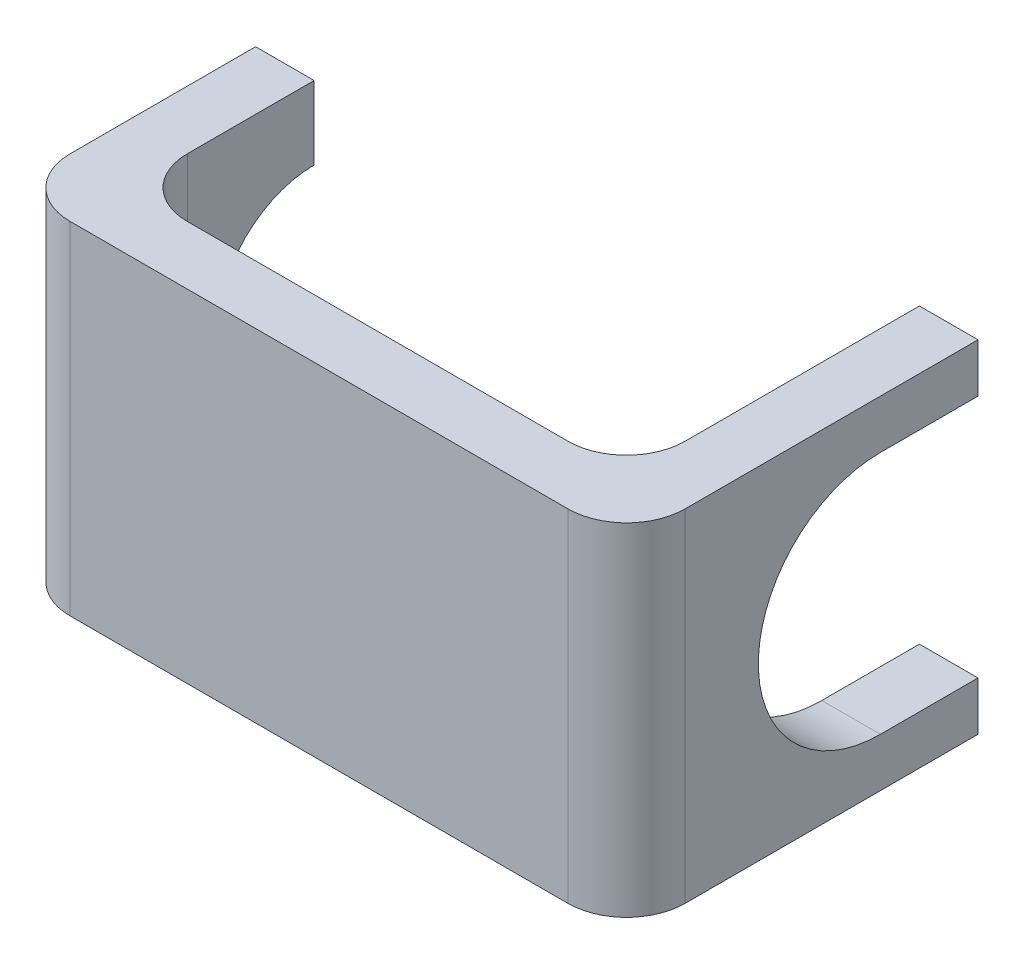
ISO-10303-21;
HEADER;
FILE_DESCRIPTION(('STEP AP214'),'2;1');
FILE_NAME('part.step','',(''),(''),'','','');
FILE_SCHEMA(('AUTOMOTIVE_DESIGN { 1 0 10303 214 1 1 1 1 }'));
ENDSEC;
DATA;
#1=APPLICATION_CONTEXT('core data for automotive mechanical design processes');
#2=APPLICATION_PROTOCOL_DEFINITION('international standard','automotive_design',2000,#1);
#3=PRODUCT_CONTEXT('',#1,'mechanical');
#4=PRODUCT('Part','Part','',(#3));
#5=PRODUCT_RELATED_PRODUCT_CATEGORY('part','',(#4));
#6=PRODUCT_DEFINITION_FORMATION('','',#4);
#7=PRODUCT_DEFINITION_CONTEXT('part definition',#1,'design');
#8=PRODUCT_DEFINITION('design','',#6,#7);
#9=PRODUCT_DEFINITION_SHAPE('','',#8);
#10=(LENGTH_UNIT() NAMED_UNIT(*) SI_UNIT(.MILLI.,.METRE.));
#11=(NAMED_UNIT(*) PLANE_ANGLE_UNIT() SI_UNIT($,.RADIAN.));
#12=(NAMED_UNIT(*) SI_UNIT($,.STERADIAN.) SOLID_ANGLE_UNIT());
#13=UNCERTAINTY_MEASURE_WITH_UNIT(LENGTH_MEASURE(1.E-05),#10,'distance_accuracy_value','');
#14=(GEOMETRIC_REPRESENTATION_CONTEXT(3) GLOBAL_UNCERTAINTY_ASSIGNED_CONTEXT((#13)) GLOBAL_UNIT_ASSIGNED_CONTEXT((#10,
#11,#12)) REPRESENTATION_CONTEXT('',''));
#15=CARTESIAN_POINT('',(0.,0.,0.));
#16=DIRECTION('',(0.,0.,1.));
#17=DIRECTION('',(1.,0.,0.));
#18=AXIS2_PLACEMENT_3D('',#15,#16,#17);
#19=CARTESIAN_POINT('',(0.,3.5,-1.9));
#20=DIRECTION('',(0.,0.,1.));
#21=DIRECTION('',(1.,0.,0.));
#22=AXIS2_PLACEMENT_3D('',#19,#20,#21);
#23=PLANE('',#22);
#24=DIRECTION('',(0.,-1.,0.));
#25=VECTOR('',#24,1.);
#26=CARTESIAN_POINT('',(0.,3.5,-1.9));
#27=LINE('',#26,#25);
#28=CARTESIAN_POINT('',(0.,3.5,-1.9));
#29=VERTEX_POINT('',#28);
#30=CARTESIAN_POINT('',(0.,2.75,-1.9));
#31=VERTEX_POINT('',#30);
#32=EDGE_CURVE('E171',#29,#31,#27,.T.);
#33=ORIENTED_EDGE('',*,*,#32,.T.);
#34=DIRECTION('',(-1.,0.,0.));
#35=VECTOR('',#34,1.);
#36=CARTESIAN_POINT('',(9.4,2.75,-1.9));
#37=LINE('',#36,#35);
#38=CARTESIAN_POINT('',(-0.6,2.75,-1.9));
#39=VERTEX_POINT('',#38);
#40=EDGE_CURVE('E158',#31,#39,#37,.T.);
#41=ORIENTED_EDGE('',*,*,#40,.T.);
#42=DIRECTION('',(0.,-1.,0.));
#43=VECTOR('',#42,1.);
#44=CARTESIAN_POINT('',(-0.6,3.5,-1.9));
#45=LINE('',#44,#43);
#46=CARTESIAN_POINT('',(-0.6,3.5,-1.9));
#47=VERTEX_POINT('',#46);
#48=EDGE_CURVE('E168',#47,#39,#45,.T.);
#49=ORIENTED_EDGE('',*,*,#48,.F.);
#50=DIRECTION('',(-1.,0.,0.));
#51=VECTOR('',#50,1.);
#52=CARTESIAN_POINT('',(0.,3.5,-1.9));
#53=LINE('',#52,#51);
#54=EDGE_CURVE('E258',#29,#47,#53,.T.);
#55=ORIENTED_EDGE('',*,*,#54,.F.);
#56=EDGE_LOOP('',(#33,#41,#49,#55));
#57=FACE_BOUND('',#56,.T.);
#58=ADVANCED_FACE('F33',(#57),#23,.F.);
#59=CARTESIAN_POINT('',(5.1,3.5,-3.));
#60=DIRECTION('',(0.,0.,1.));
#61=DIRECTION('',(1.,0.,0.));
#62=AXIS2_PLACEMENT_3D('',#59,#60,#61);
#63=PLANE('',#62);
#64=DIRECTION('',(0.,-1.,0.));
#65=VECTOR('',#64,1.);
#66=CARTESIAN_POINT('',(5.7,3.5,-3.));
#67=LINE('',#66,#65);
#68=CARTESIAN_POINT('',(5.7,3.5,-3.));
#69=VERTEX_POINT('',#68);
#70=CARTESIAN_POINT('',(5.7,3.,-3.));
#71=VERTEX_POINT('',#70);
#72=EDGE_CURVE('E180',#69,#71,#67,.T.);
#73=ORIENTED_EDGE('',*,*,#72,.T.);
#74=DIRECTION('',(1.,0.,0.));
#75=VECTOR('',#74,1.);
#76=CARTESIAN_POINT('',(1.7,3.,-3.));
#77=LINE('',#76,#75);
#78=CARTESIAN_POINT('',(5.1,3.,-3.));
#79=VERTEX_POINT('',#78);
#80=EDGE_CURVE('E241',#79,#71,#77,.T.);
#81=ORIENTED_EDGE('',*,*,#80,.F.);
#82=DIRECTION('',(0.,-1.,0.));
#83=VECTOR('',#82,1.);
#84=CARTESIAN_POINT('',(5.1,3.5,-3.));
#85=LINE('',#84,#83);
#86=CARTESIAN_POINT('',(5.1,3.5,-3.));
#87=VERTEX_POINT('',#86);
#88=EDGE_CURVE('E290',#87,#79,#85,.T.);
#89=ORIENTED_EDGE('',*,*,#88,.F.);
#90=DIRECTION('',(-1.,0.,0.));
#91=VECTOR('',#90,1.);
#92=CARTESIAN_POINT('',(5.1,3.5,-3.));
#93=LINE('',#92,#91);
#94=EDGE_CURVE('E266',#69,#87,#93,.T.);
#95=ORIENTED_EDGE('',*,*,#94,.F.);
#96=EDGE_LOOP('',(#73,#81,#89,#95));
#97=FACE_BOUND('',#96,.T.);
#98=ADVANCED_FACE('F351',(#97),#63,.F.);
#99=CARTESIAN_POINT('',(0.,3.5,0.));
#100=DIRECTION('',(0.,0.,1.));
#101=DIRECTION('',(1.,0.,0.));
#102=AXIS2_PLACEMENT_3D('',#99,#100,#101);
#103=PLANE('',#102);
#104=DIRECTION('',(-1.,0.,0.));
#105=VECTOR('',#104,1.);
#106=CARTESIAN_POINT('',(0.,3.5,0.));
#107=LINE('',#106,#105);
#108=CARTESIAN_POINT('',(4.5,3.5,0.));
#109=VERTEX_POINT('',#108);
#110=CARTESIAN_POINT('',(0.6,3.5,0.));
#111=VERTEX_POINT('',#110);
#112=EDGE_CURVE('E252',#109,#111,#107,.T.);
#113=ORIENTED_EDGE('',*,*,#112,.F.);
#114=DIRECTION('',(0.,-1.,0.));
#115=VECTOR('',#114,1.);
#116=CARTESIAN_POINT('',(4.5,0.,0.));
#117=LINE('',#116,#115);
#118=CARTESIAN_POINT('',(4.5,0.,0.));
#119=VERTEX_POINT('',#118);
#120=EDGE_CURVE('E202',#109,#119,#117,.T.);
#121=ORIENTED_EDGE('',*,*,#120,.T.);
#122=DIRECTION('',(-1.,0.,0.));
#123=VECTOR('',#122,1.);
#124=CARTESIAN_POINT('',(0.,0.,0.));
#125=LINE('',#124,#123);
#126=CARTESIAN_POINT('',(0.6,0.,0.));
#127=VERTEX_POINT('',#126);
#128=EDGE_CURVE('E240',#119,#127,#125,.T.);
#129=ORIENTED_EDGE('',*,*,#128,.T.);
#130=DIRECTION('',(0.,-1.,0.));
#131=VECTOR('',#130,1.);
#132=CARTESIAN_POINT('',(0.6,3.5,0.));
#133=LINE('',#132,#131);
#134=EDGE_CURVE('E200',#127,#111,#133,.F.);
#135=ORIENTED_EDGE('',*,*,#134,.T.);
#136=EDGE_LOOP('',(#113,#121,#129,#135));
#137=FACE_BOUND('',#136,.T.);
#138=ADVANCED_FACE('F310',(#137),#103,.F.);
#139=CARTESIAN_POINT('',(0.,3.5,0.));
#140=DIRECTION('',(-1.,0.,0.));
#141=DIRECTION('',(0.,0.,1.));
#142=AXIS2_PLACEMENT_3D('',#139,#140,#141);
#143=PLANE('',#142);
#144=CARTESIAN_POINT('',(0.,0.75,-1.9));
#145=VERTEX_POINT('',#144);
#146=CARTESIAN_POINT('',(0.,0.,-1.9));
#147=VERTEX_POINT('',#146);
#148=EDGE_CURVE('E176',#145,#147,#27,.T.);
#149=ORIENTED_EDGE('',*,*,#148,.F.);
#150=CARTESIAN_POINT('',(0.,1.75,-1.9));
#151=DIRECTION('',(-1.,0.,0.));
#152=DIRECTION('',(0.,0.,1.));
#153=AXIS2_PLACEMENT_3D('',#150,#151,#152);
#154=CIRCLE('',#153,1.);
#155=EDGE_CURVE('E326',#145,#31,#154,.T.);
#156=ORIENTED_EDGE('',*,*,#155,.T.);
#157=ORIENTED_EDGE('',*,*,#32,.F.);
#158=DIRECTION('',(0.,0.,-1.));
#159=VECTOR('',#158,1.);
#160=CARTESIAN_POINT('',(0.,3.5,0.));
#161=LINE('',#160,#159);
#162=CARTESIAN_POINT('',(0.,3.5,-0.6));
#163=VERTEX_POINT('',#162);
#164=EDGE_CURVE('E255',#163,#29,#161,.T.);
#165=ORIENTED_EDGE('',*,*,#164,.F.);
#166=DIRECTION('',(0.,-1.,0.));
#167=VECTOR('',#166,1.);
#168=CARTESIAN_POINT('',(0.,0.,-0.6));
#169=LINE('',#168,#167);
#170=CARTESIAN_POINT('',(0.,0.,-0.6));
#171=VERTEX_POINT('',#170);
#172=EDGE_CURVE('E209',#163,#171,#169,.T.);
#173=ORIENTED_EDGE('',*,*,#172,.T.);
#174=DIRECTION('',(0.,0.,-1.));
#175=VECTOR('',#174,1.);
#176=CARTESIAN_POINT('',(0.,0.,0.));
#177=LINE('',#176,#175);
#178=EDGE_CURVE('E244',#171,#147,#177,.T.);
#179=ORIENTED_EDGE('',*,*,#178,.T.);
#180=EDGE_LOOP('',(#149,#156,#157,#165,#173,#179));
#181=FACE_BOUND('',#180,.T.);
#182=ADVANCED_FACE('F321',(#181),#143,.F.);
#183=CARTESIAN_POINT('',(-0.6,0.75,-1.9));
#184=VERTEX_POINT('',#183);
#185=CARTESIAN_POINT('',(-0.6,0.,-1.9));
#186=VERTEX_POINT('',#185);
#187=EDGE_CURVE('E177',#184,#186,#45,.T.);
#188=ORIENTED_EDGE('',*,*,#187,.F.);
#189=DIRECTION('',(-1.,0.,0.));
#190=VECTOR('',#189,1.);
#191=CARTESIAN_POINT('',(9.4,0.75,-1.9));
#192=LINE('',#191,#190);
#193=EDGE_CURVE('E48',#145,#184,#192,.T.);
#194=ORIENTED_EDGE('',*,*,#193,.F.);
#195=ORIENTED_EDGE('',*,*,#148,.T.);
#196=DIRECTION('',(-1.,0.,0.));
#197=VECTOR('',#196,1.);
#198=CARTESIAN_POINT('',(0.,0.,-1.9));
#199=LINE('',#198,#197);
#200=EDGE_CURVE('E274',#147,#186,#199,.T.);
#201=ORIENTED_EDGE('',*,*,#200,.T.);
#202=EDGE_LOOP('',(#188,#194,#195,#201));
#203=FACE_BOUND('',#202,.T.);
#204=ADVANCED_FACE('F325',(#203),#23,.F.);
#205=CARTESIAN_POINT('',(-0.6,3.5,-1.9));
#206=DIRECTION('',(1.,0.,0.));
#207=DIRECTION('',(0.,0.,-1.));
#208=AXIS2_PLACEMENT_3D('',#205,#206,#207);
#209=PLANE('',#208);
#210=ORIENTED_EDGE('',*,*,#48,.T.);
#211=CARTESIAN_POINT('',(-0.6,1.75,-1.9));
#212=DIRECTION('',(-1.,0.,0.));
#213=DIRECTION('',(0.,0.,-1.));
#214=AXIS2_PLACEMENT_3D('',#211,#212,#213);
#215=CIRCLE('',#214,1.);
#216=EDGE_CURVE('E155',#184,#39,#215,.T.);
#217=ORIENTED_EDGE('',*,*,#216,.F.);
#218=ORIENTED_EDGE('',*,*,#187,.T.);
#219=DIRECTION('',(0.,0.,1.));
#220=VECTOR('',#219,1.);
#221=CARTESIAN_POINT('',(-0.6,0.,-1.9));
#222=LINE('',#221,#220);
#223=CARTESIAN_POINT('',(-0.6,0.,0.));
#224=VERTEX_POINT('',#223);
#225=EDGE_CURVE('E277',#186,#224,#222,.T.);
#226=ORIENTED_EDGE('',*,*,#225,.T.);
#227=DIRECTION('',(0.,-1.,0.));
#228=VECTOR('',#227,1.);
#229=CARTESIAN_POINT('',(-0.6,3.5,0.));
#230=LINE('',#229,#228);
#231=CARTESIAN_POINT('',(-0.6,3.5,0.));
#232=VERTEX_POINT('',#231);
#233=EDGE_CURVE('E207',#224,#232,#230,.F.);
#234=ORIENTED_EDGE('',*,*,#233,.T.);
#235=DIRECTION('',(0.,0.,1.));
#236=VECTOR('',#235,1.);
#237=CARTESIAN_POINT('',(-0.6,3.5,-1.9));
#238=LINE('',#237,#236);
#239=EDGE_CURVE('E175',#47,#232,#238,.T.);
#240=ORIENTED_EDGE('',*,*,#239,.F.);
#241=EDGE_LOOP('',(#210,#217,#218,#226,#234,#240));
#242=FACE_BOUND('',#241,.T.);
#243=ADVANCED_FACE('F173',(#242),#209,.F.);
#244=CARTESIAN_POINT('',(-0.600000000000001,3.5,0.6));
#245=DIRECTION('',(0.,0.,-1.));
#246=DIRECTION('',(-1.,0.,0.));
#247=AXIS2_PLACEMENT_3D('',#244,#245,#246);
#248=PLANE('',#247);
#249=DIRECTION('',(1.,0.,0.));
#250=VECTOR('',#249,1.);
#251=CARTESIAN_POINT('',(-0.600000000000001,0.,0.6));
#252=LINE('',#251,#250);
#253=CARTESIAN_POINT('',(0.,0.,0.6));
#254=VERTEX_POINT('',#253);
#255=CARTESIAN_POINT('',(5.1,0.,0.6));
#256=VERTEX_POINT('',#255);
#257=EDGE_CURVE('E280',#254,#256,#252,.T.);
#258=ORIENTED_EDGE('',*,*,#257,.T.);
#259=DIRECTION('',(0.,-1.,0.));
#260=VECTOR('',#259,1.);
#261=CARTESIAN_POINT('',(5.1,3.5,0.6));
#262=LINE('',#261,#260);
#263=CARTESIAN_POINT('',(5.1,3.5,0.6));
#264=VERTEX_POINT('',#263);
#265=EDGE_CURVE('E194',#256,#264,#262,.F.);
#266=ORIENTED_EDGE('',*,*,#265,.T.);
#267=DIRECTION('',(1.,0.,0.));
#268=VECTOR('',#267,1.);
#269=CARTESIAN_POINT('',(-0.600000000000001,3.5,0.6));
#270=LINE('',#269,#268);
#271=CARTESIAN_POINT('',(0.,3.5,0.6));
#272=VERTEX_POINT('',#271);
#273=EDGE_CURVE('E261',#272,#264,#270,.T.);
#274=ORIENTED_EDGE('',*,*,#273,.F.);
#275=DIRECTION('',(0.,-1.,0.));
#276=VECTOR('',#275,1.);
#277=CARTESIAN_POINT('',(0.,3.5,0.6));
#278=LINE('',#277,#276);
#279=EDGE_CURVE('E191',#272,#254,#278,.T.);
#280=ORIENTED_EDGE('',*,*,#279,.T.);
#281=EDGE_LOOP('',(#258,#266,#274,#280));
#282=FACE_BOUND('',#281,.T.);
#283=ADVANCED_FACE('F342',(#282),#248,.F.);
#284=CARTESIAN_POINT('',(5.7,3.5,-3.));
#285=DIRECTION('',(-1.,0.,0.));
#286=DIRECTION('',(0.,0.,1.));
#287=AXIS2_PLACEMENT_3D('',#284,#285,#286);
#288=PLANE('',#287);
#289=CARTESIAN_POINT('',(5.7,1.75,-2.));
#290=DIRECTION('',(1.,0.,0.));
#291=DIRECTION('',(0.,0.,-1.));
#292=AXIS2_PLACEMENT_3D('',#289,#290,#291);
#293=CIRCLE('',#292,1.25);
#294=CARTESIAN_POINT('',(5.7,3.,-2.));
#295=VERTEX_POINT('',#294);
#296=CARTESIAN_POINT('',(5.7,0.5,-2.));
#297=VERTEX_POINT('',#296);
#298=EDGE_CURVE('E327',#295,#297,#293,.T.);
#299=ORIENTED_EDGE('',*,*,#298,.F.);
#300=DIRECTION('',(0.,0.,1.));
#301=VECTOR('',#300,1.);
#302=CARTESIAN_POINT('',(5.7,3.,-2.));
#303=LINE('',#302,#301);
#304=EDGE_CURVE('E238',#71,#295,#303,.T.);
#305=ORIENTED_EDGE('',*,*,#304,.F.);
#306=ORIENTED_EDGE('',*,*,#72,.F.);
#307=DIRECTION('',(0.,0.,-1.));
#308=VECTOR('',#307,1.);
#309=CARTESIAN_POINT('',(5.7,3.5,-3.));
#310=LINE('',#309,#308);
#311=CARTESIAN_POINT('',(5.7,3.5,0.));
#312=VERTEX_POINT('',#311);
#313=EDGE_CURVE('E264',#312,#69,#310,.T.);
#314=ORIENTED_EDGE('',*,*,#313,.F.);
#315=DIRECTION('',(0.,-1.,0.));
#316=VECTOR('',#315,1.);
#317=CARTESIAN_POINT('',(5.7,3.5,0.));
#318=LINE('',#317,#316);
#319=CARTESIAN_POINT('',(5.7,0.,0.));
#320=VERTEX_POINT('',#319);
#321=EDGE_CURVE('E184',#312,#320,#318,.T.);
#322=ORIENTED_EDGE('',*,*,#321,.T.);
#323=DIRECTION('',(0.,0.,-1.));
#324=VECTOR('',#323,1.);
#325=CARTESIAN_POINT('',(5.7,0.,-3.));
#326=LINE('',#325,#324);
#327=CARTESIAN_POINT('',(5.7,0.,-3.));
#328=VERTEX_POINT('',#327);
#329=EDGE_CURVE('E283',#320,#328,#326,.T.);
#330=ORIENTED_EDGE('',*,*,#329,.T.);
#331=CARTESIAN_POINT('',(5.7,0.5,-3.));
#332=VERTEX_POINT('',#331);
#333=EDGE_CURVE('E291',#332,#328,#67,.T.);
#334=ORIENTED_EDGE('',*,*,#333,.F.);
#335=DIRECTION('',(0.,0.,-1.));
#336=VECTOR('',#335,1.);
#337=CARTESIAN_POINT('',(5.7,0.5,-3.));
#338=LINE('',#337,#336);
#339=EDGE_CURVE('E329',#297,#332,#338,.T.);
#340=ORIENTED_EDGE('',*,*,#339,.F.);
#341=EDGE_LOOP('',(#299,#305,#306,#314,#322,#330,#334,#340));
#342=FACE_BOUND('',#341,.T.);
#343=ADVANCED_FACE('F335',(#342),#288,.F.);
#344=CARTESIAN_POINT('',(5.1,0.5,-3.));
#345=VERTEX_POINT('',#344);
#346=CARTESIAN_POINT('',(5.1,0.,-3.));
#347=VERTEX_POINT('',#346);
#348=EDGE_CURVE('E270',#345,#347,#85,.T.);
#349=ORIENTED_EDGE('',*,*,#348,.F.);
#350=DIRECTION('',(1.,0.,0.));
#351=VECTOR('',#350,1.);
#352=CARTESIAN_POINT('',(1.7,0.5,-3.));
#353=LINE('',#352,#351);
#354=EDGE_CURVE('E56',#345,#332,#353,.T.);
#355=ORIENTED_EDGE('',*,*,#354,.T.);
#356=ORIENTED_EDGE('',*,*,#333,.T.);
#357=DIRECTION('',(-1.,0.,0.));
#358=VECTOR('',#357,1.);
#359=CARTESIAN_POINT('',(5.1,0.,-3.));
#360=LINE('',#359,#358);
#361=EDGE_CURVE('E286',#328,#347,#360,.T.);
#362=ORIENTED_EDGE('',*,*,#361,.T.);
#363=EDGE_LOOP('',(#349,#355,#356,#362));
#364=FACE_BOUND('',#363,.T.);
#365=ADVANCED_FACE('F298',(#364),#63,.F.);
#366=CARTESIAN_POINT('',(5.1,3.5,0.));
#367=DIRECTION('',(1.,0.,0.));
#368=DIRECTION('',(0.,0.,-1.));
#369=AXIS2_PLACEMENT_3D('',#366,#367,#368);
#370=PLANE('',#369);
#371=ORIENTED_EDGE('',*,*,#88,.T.);
#372=DIRECTION('',(0.,0.,1.));
#373=VECTOR('',#372,1.);
#374=CARTESIAN_POINT('',(5.1,3.,0.));
#375=LINE('',#374,#373);
#376=CARTESIAN_POINT('',(5.1,3.,-2.));
#377=VERTEX_POINT('',#376);
#378=EDGE_CURVE('E11',#79,#377,#375,.T.);
#379=ORIENTED_EDGE('',*,*,#378,.T.);
#380=CARTESIAN_POINT('',(5.1,1.75,-2.));
#381=DIRECTION('',(1.,0.,0.));
#382=DIRECTION('',(0.,0.,-1.));
#383=AXIS2_PLACEMENT_3D('',#380,#381,#382);
#384=CIRCLE('',#383,1.25);
#385=CARTESIAN_POINT('',(5.1,0.5,-2.));
#386=VERTEX_POINT('',#385);
#387=EDGE_CURVE('E41',#377,#386,#384,.T.);
#388=ORIENTED_EDGE('',*,*,#387,.T.);
#389=DIRECTION('',(0.,0.,-1.));
#390=VECTOR('',#389,1.);
#391=CARTESIAN_POINT('',(5.1,0.499999999999999,0.));
#392=LINE('',#391,#390);
#393=EDGE_CURVE('E220',#386,#345,#392,.T.);
#394=ORIENTED_EDGE('',*,*,#393,.T.);
#395=ORIENTED_EDGE('',*,*,#348,.T.);
#396=DIRECTION('',(0.,0.,1.));
#397=VECTOR('',#396,1.);
#398=CARTESIAN_POINT('',(5.1,0.,0.));
#399=LINE('',#398,#397);
#400=CARTESIAN_POINT('',(5.1,0.,-0.6));
#401=VERTEX_POINT('',#400);
#402=EDGE_CURVE('E256',#347,#401,#399,.T.);
#403=ORIENTED_EDGE('',*,*,#402,.T.);
#404=DIRECTION('',(0.,-1.,0.));
#405=VECTOR('',#404,1.);
#406=CARTESIAN_POINT('',(5.1,3.5,-0.6));
#407=LINE('',#406,#405);
#408=CARTESIAN_POINT('',(5.1,3.5,-0.6));
#409=VERTEX_POINT('',#408);
#410=EDGE_CURVE('E205',#401,#409,#407,.F.);
#411=ORIENTED_EDGE('',*,*,#410,.T.);
#412=DIRECTION('',(0.,0.,1.));
#413=VECTOR('',#412,1.);
#414=CARTESIAN_POINT('',(5.1,3.5,0.));
#415=LINE('',#414,#413);
#416=EDGE_CURVE('E268',#87,#409,#415,.T.);
#417=ORIENTED_EDGE('',*,*,#416,.F.);
#418=EDGE_LOOP('',(#371,#379,#388,#394,#395,#403,#411,#417));
#419=FACE_BOUND('',#418,.T.);
#420=ADVANCED_FACE('F224',(#419),#370,.F.);
#421=CARTESIAN_POINT('',(0.,3.5,0.));
#422=DIRECTION('',(0.,1.,0.));
#423=DIRECTION('',(0.,0.,1.));
#424=AXIS2_PLACEMENT_3D('',#421,#422,#423);
#425=PLANE('',#424);
#426=ORIENTED_EDGE('',*,*,#273,.T.);
#427=CARTESIAN_POINT('',(5.1,3.5,0.));
#428=DIRECTION('',(0.,1.,0.));
#429=DIRECTION('',(0.,0.,1.));
#430=AXIS2_PLACEMENT_3D('',#427,#428,#429);
#431=CIRCLE('',#430,0.6);
#432=EDGE_CURVE('E198',#264,#312,#431,.T.);
#433=ORIENTED_EDGE('',*,*,#432,.T.);
#434=ORIENTED_EDGE('',*,*,#313,.T.);
#435=ORIENTED_EDGE('',*,*,#94,.T.);
#436=ORIENTED_EDGE('',*,*,#416,.T.);
#437=CARTESIAN_POINT('',(4.5,3.5,-0.6));
#438=DIRECTION('',(0.,1.,0.));
#439=DIRECTION('',(0.,0.,1.));
#440=AXIS2_PLACEMENT_3D('',#437,#438,#439);
#441=CIRCLE('',#440,0.6);
#442=EDGE_CURVE('E214',#409,#109,#441,.F.);
#443=ORIENTED_EDGE('',*,*,#442,.T.);
#444=ORIENTED_EDGE('',*,*,#112,.T.);
#445=CARTESIAN_POINT('',(0.6,3.5,-0.6));
#446=DIRECTION('',(0.,1.,0.));
#447=DIRECTION('',(0.,0.,1.));
#448=AXIS2_PLACEMENT_3D('',#445,#446,#447);
#449=CIRCLE('',#448,0.6);
#450=EDGE_CURVE('E218',#111,#163,#449,.F.);
#451=ORIENTED_EDGE('',*,*,#450,.T.);
#452=ORIENTED_EDGE('',*,*,#164,.T.);
#453=ORIENTED_EDGE('',*,*,#54,.T.);
#454=ORIENTED_EDGE('',*,*,#239,.T.);
#455=CARTESIAN_POINT('',(0.,3.5,0.));
#456=DIRECTION('',(0.,1.,0.));
#457=DIRECTION('',(0.,0.,1.));
#458=AXIS2_PLACEMENT_3D('',#455,#456,#457);
#459=CIRCLE('',#458,0.6);
#460=EDGE_CURVE('E196',#232,#272,#459,.T.);
#461=ORIENTED_EDGE('',*,*,#460,.T.);
#462=EDGE_LOOP('',(#426,#433,#434,#435,#436,#443,#444,#451,#452,#453,#454,#461));
#463=FACE_BOUND('',#462,.T.);
#464=ADVANCED_FACE('F314',(#463),#425,.T.);
#465=CARTESIAN_POINT('',(0.,0.,0.));
#466=DIRECTION('',(0.,1.,0.));
#467=DIRECTION('',(0.,0.,1.));
#468=AXIS2_PLACEMENT_3D('',#465,#466,#467);
#469=PLANE('',#468);
#470=ORIENTED_EDGE('',*,*,#329,.F.);
#471=CARTESIAN_POINT('',(5.1,0.,0.));
#472=DIRECTION('',(0.,1.,0.));
#473=DIRECTION('',(0.,0.,1.));
#474=AXIS2_PLACEMENT_3D('',#471,#472,#473);
#475=CIRCLE('',#474,0.6);
#476=EDGE_CURVE('E189',#320,#256,#475,.F.);
#477=ORIENTED_EDGE('',*,*,#476,.T.);
#478=ORIENTED_EDGE('',*,*,#257,.F.);
#479=CARTESIAN_POINT('',(0.,0.,0.));
#480=DIRECTION('',(0.,1.,0.));
#481=DIRECTION('',(0.,0.,1.));
#482=AXIS2_PLACEMENT_3D('',#479,#480,#481);
#483=CIRCLE('',#482,0.6);
#484=EDGE_CURVE('E187',#254,#224,#483,.F.);
#485=ORIENTED_EDGE('',*,*,#484,.T.);
#486=ORIENTED_EDGE('',*,*,#225,.F.);
#487=ORIENTED_EDGE('',*,*,#200,.F.);
#488=ORIENTED_EDGE('',*,*,#178,.F.);
#489=CARTESIAN_POINT('',(0.6,0.,-0.6));
#490=DIRECTION('',(0.,1.,0.));
#491=DIRECTION('',(0.,0.,1.));
#492=AXIS2_PLACEMENT_3D('',#489,#490,#491);
#493=CIRCLE('',#492,0.6);
#494=EDGE_CURVE('E216',#171,#127,#493,.T.);
#495=ORIENTED_EDGE('',*,*,#494,.T.);
#496=ORIENTED_EDGE('',*,*,#128,.F.);
#497=CARTESIAN_POINT('',(4.5,0.,-0.6));
#498=DIRECTION('',(0.,1.,0.));
#499=DIRECTION('',(0.,0.,1.));
#500=AXIS2_PLACEMENT_3D('',#497,#498,#499);
#501=CIRCLE('',#500,0.6);
#502=EDGE_CURVE('E212',#119,#401,#501,.T.);
#503=ORIENTED_EDGE('',*,*,#502,.T.);
#504=ORIENTED_EDGE('',*,*,#402,.F.);
#505=ORIENTED_EDGE('',*,*,#361,.F.);
#506=EDGE_LOOP('',(#470,#477,#478,#485,#486,#487,#488,#495,#496,#503,#504,#505));
#507=FACE_BOUND('',#506,.T.);
#508=ADVANCED_FACE('F302',(#507),#469,.F.);
#509=CARTESIAN_POINT('',(5.1,3.5,0.));
#510=DIRECTION('',(0.,-1.,0.));
#511=DIRECTION('',(0.,0.,-1.));
#512=AXIS2_PLACEMENT_3D('',#509,#510,#511);
#513=CYLINDRICAL_SURFACE('',#512,0.6);
#514=ORIENTED_EDGE('',*,*,#432,.F.);
#515=ORIENTED_EDGE('',*,*,#265,.F.);
#516=ORIENTED_EDGE('',*,*,#476,.F.);
#517=ORIENTED_EDGE('',*,*,#321,.F.);
#518=EDGE_LOOP('',(#514,#515,#516,#517));
#519=FACE_BOUND('',#518,.T.);
#520=ADVANCED_FACE('F346',(#519),#513,.T.);
#521=CARTESIAN_POINT('',(4.5,3.5,-0.6));
#522=DIRECTION('',(0.,1.,0.));
#523=DIRECTION('',(0.,0.,1.));
#524=AXIS2_PLACEMENT_3D('',#521,#522,#523);
#525=CYLINDRICAL_SURFACE('',#524,0.6);
#526=ORIENTED_EDGE('',*,*,#442,.F.);
#527=ORIENTED_EDGE('',*,*,#410,.F.);
#528=ORIENTED_EDGE('',*,*,#502,.F.);
#529=ORIENTED_EDGE('',*,*,#120,.F.);
#530=EDGE_LOOP('',(#526,#527,#528,#529));
#531=FACE_BOUND('',#530,.T.);
#532=ADVANCED_FACE('F307',(#531),#525,.F.);
#533=CARTESIAN_POINT('',(0.,3.5,0.));
#534=DIRECTION('',(0.,-1.,0.));
#535=DIRECTION('',(0.,0.,-1.));
#536=AXIS2_PLACEMENT_3D('',#533,#534,#535);
#537=CYLINDRICAL_SURFACE('',#536,0.6);
#538=ORIENTED_EDGE('',*,*,#460,.F.);
#539=ORIENTED_EDGE('',*,*,#233,.F.);
#540=ORIENTED_EDGE('',*,*,#484,.F.);
#541=ORIENTED_EDGE('',*,*,#279,.F.);
#542=EDGE_LOOP('',(#538,#539,#540,#541));
#543=FACE_BOUND('',#542,.T.);
#544=ADVANCED_FACE('F380',(#543),#537,.T.);
#545=CARTESIAN_POINT('',(0.6,3.5,-0.6));
#546=DIRECTION('',(0.,1.,0.));
#547=DIRECTION('',(0.,0.,1.));
#548=AXIS2_PLACEMENT_3D('',#545,#546,#547);
#549=CYLINDRICAL_SURFACE('',#548,0.6);
#550=ORIENTED_EDGE('',*,*,#450,.F.);
#551=ORIENTED_EDGE('',*,*,#134,.F.);
#552=ORIENTED_EDGE('',*,*,#494,.F.);
#553=ORIENTED_EDGE('',*,*,#172,.F.);
#554=EDGE_LOOP('',(#550,#551,#552,#553));
#555=FACE_BOUND('',#554,.T.);
#556=ADVANCED_FACE('F35',(#555),#549,.F.);
#557=CARTESIAN_POINT('',(1.7,1.75,-2.));
#558=DIRECTION('',(1.,0.,0.));
#559=DIRECTION('',(0.,0.,-1.));
#560=AXIS2_PLACEMENT_3D('',#557,#558,#559);
#561=CYLINDRICAL_SURFACE('',#560,1.25);
#562=DIRECTION('',(1.,0.,0.));
#563=VECTOR('',#562,1.);
#564=CARTESIAN_POINT('',(1.7,3.,-2.));
#565=LINE('',#564,#563);
#566=EDGE_CURVE('E231',#377,#295,#565,.T.);
#567=ORIENTED_EDGE('',*,*,#566,.T.);
#568=ORIENTED_EDGE('',*,*,#298,.T.);
#569=DIRECTION('',(1.,0.,0.));
#570=VECTOR('',#569,1.);
#571=CARTESIAN_POINT('',(1.7,0.5,-2.));
#572=LINE('',#571,#570);
#573=EDGE_CURVE('E233',#386,#297,#572,.T.);
#574=ORIENTED_EDGE('',*,*,#573,.F.);
#575=ORIENTED_EDGE('',*,*,#387,.F.);
#576=EDGE_LOOP('',(#567,#568,#574,#575));
#577=FACE_BOUND('',#576,.T.);
#578=ADVANCED_FACE('F229',(#577),#561,.F.);
#579=CARTESIAN_POINT('',(1.7,3.,-2.));
#580=DIRECTION('',(0.,1.,0.));
#581=DIRECTION('',(0.,0.,1.));
#582=AXIS2_PLACEMENT_3D('',#579,#580,#581);
#583=PLANE('',#582);
#584=ORIENTED_EDGE('',*,*,#80,.T.);
#585=ORIENTED_EDGE('',*,*,#304,.T.);
#586=ORIENTED_EDGE('',*,*,#566,.F.);
#587=ORIENTED_EDGE('',*,*,#378,.F.);
#588=EDGE_LOOP('',(#584,#585,#586,#587));
#589=FACE_BOUND('',#588,.T.);
#590=ADVANCED_FACE('F235',(#589),#583,.F.);
#591=CARTESIAN_POINT('',(1.7,0.5,-3.));
#592=DIRECTION('',(0.,-1.,0.));
#593=DIRECTION('',(0.,0.,-1.));
#594=AXIS2_PLACEMENT_3D('',#591,#592,#593);
#595=PLANE('',#594);
#596=ORIENTED_EDGE('',*,*,#573,.T.);
#597=ORIENTED_EDGE('',*,*,#339,.T.);
#598=ORIENTED_EDGE('',*,*,#354,.F.);
#599=ORIENTED_EDGE('',*,*,#393,.F.);
#600=EDGE_LOOP('',(#596,#597,#598,#599));
#601=FACE_BOUND('',#600,.T.);
#602=ADVANCED_FACE('F333',(#601),#595,.F.);
#603=CARTESIAN_POINT('',(9.4,1.75,-1.9));
#604=DIRECTION('',(-1.,0.,0.));
#605=DIRECTION('',(0.,0.,1.));
#606=AXIS2_PLACEMENT_3D('',#603,#604,#605);
#607=CYLINDRICAL_SURFACE('',#606,1.);
#608=ORIENTED_EDGE('',*,*,#193,.T.);
#609=ORIENTED_EDGE('',*,*,#216,.T.);
#610=ORIENTED_EDGE('',*,*,#40,.F.);
#611=ORIENTED_EDGE('',*,*,#155,.F.);
#612=EDGE_LOOP('',(#608,#609,#610,#611));
#613=FACE_BOUND('',#612,.T.);
#614=ADVANCED_FACE('F157',(#613),#607,.F.);
#615=CLOSED_SHELL('',(#58,#98,#138,#182,#204,#243,#283,#343,#365,#420,#464,#508,#520,#532,#544,
#556,#578,#590,#602,#614));
#616=MANIFOLD_SOLID_BREP('B2',#615);
#617=ADVANCED_BREP_SHAPE_REPRESENTATION('',(#18,#616),#14);
#618=SHAPE_DEFINITION_REPRESENTATION(#9,#617);
ENDSEC;
END-ISO-10303-21;
